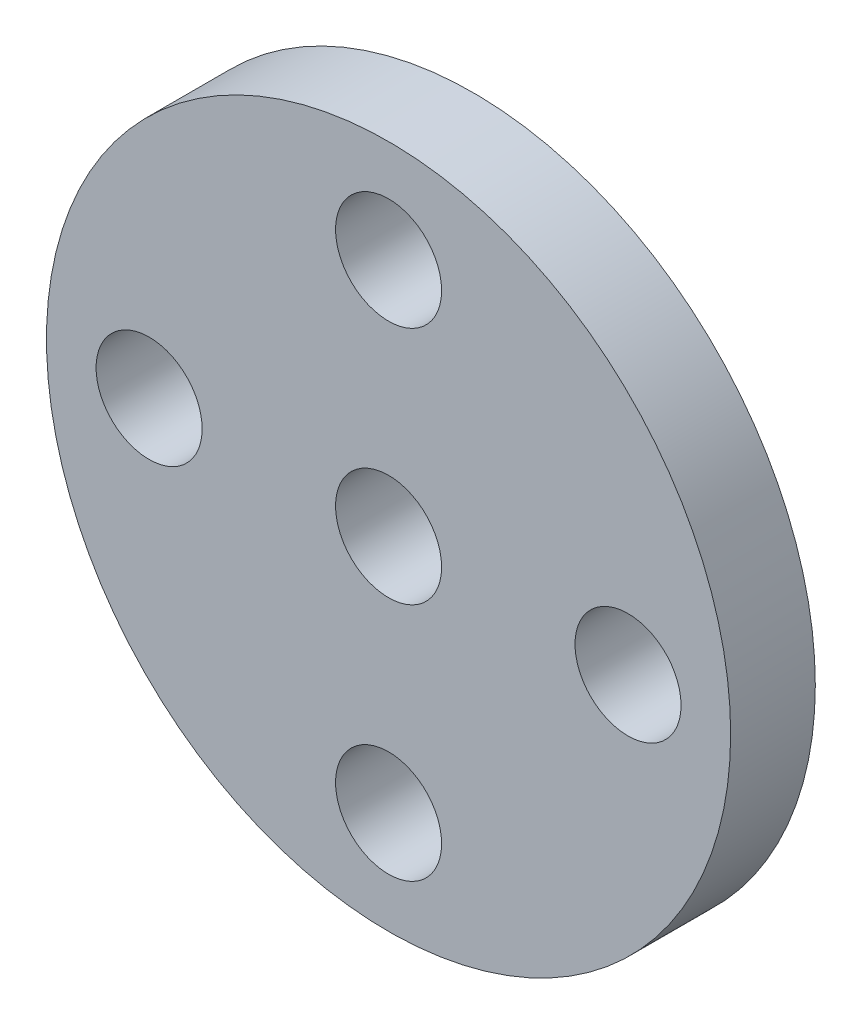
ISO-10303-21;
HEADER;
FILE_DESCRIPTION(('STEP AP214'),'2;1');
FILE_NAME('part.step','',(''),(''),'','','');
FILE_SCHEMA(('AUTOMOTIVE_DESIGN { 1 0 10303 214 1 1 1 1 }'));
ENDSEC;
DATA;
#1=APPLICATION_CONTEXT('core data for automotive mechanical design processes');
#2=APPLICATION_PROTOCOL_DEFINITION('international standard','automotive_design',2000,#1);
#3=PRODUCT_CONTEXT('',#1,'mechanical');
#4=PRODUCT('Part','Part','',(#3));
#5=PRODUCT_RELATED_PRODUCT_CATEGORY('part','',(#4));
#6=PRODUCT_DEFINITION_FORMATION('','',#4);
#7=PRODUCT_DEFINITION_CONTEXT('part definition',#1,'design');
#8=PRODUCT_DEFINITION('design','',#6,#7);
#9=PRODUCT_DEFINITION_SHAPE('','',#8);
#10=(LENGTH_UNIT() NAMED_UNIT(*) SI_UNIT(.MILLI.,.METRE.));
#11=(NAMED_UNIT(*) PLANE_ANGLE_UNIT() SI_UNIT($,.RADIAN.));
#12=(NAMED_UNIT(*) SI_UNIT($,.STERADIAN.) SOLID_ANGLE_UNIT());
#13=UNCERTAINTY_MEASURE_WITH_UNIT(LENGTH_MEASURE(1.E-05),#10,'distance_accuracy_value','');
#14=(GEOMETRIC_REPRESENTATION_CONTEXT(3) GLOBAL_UNCERTAINTY_ASSIGNED_CONTEXT((#13)) GLOBAL_UNIT_ASSIGNED_CONTEXT((#10,
#11,#12)) REPRESENTATION_CONTEXT('',''));
#15=CARTESIAN_POINT('',(0.,0.,0.));
#16=DIRECTION('',(0.,0.,1.));
#17=DIRECTION('',(1.,0.,0.));
#18=AXIS2_PLACEMENT_3D('',#15,#16,#17);
#19=CARTESIAN_POINT('',(0.,0.,0.));
#20=DIRECTION('',(0.,0.,1.));
#21=DIRECTION('',(1.,0.,0.));
#22=AXIS2_PLACEMENT_3D('',#19,#20,#21);
#23=PLANE('',#22);
#24=CARTESIAN_POINT('',(0.,0.,0.));
#25=DIRECTION('',(0.,0.,1.));
#26=DIRECTION('',(1.,0.,0.));
#27=AXIS2_PLACEMENT_3D('',#24,#25,#26);
#28=CIRCLE('',#27,1.56573644405593);
#29=CARTESIAN_POINT('',(1.56573644405593,0.,0.));
#30=VERTEX_POINT('',#29);
#31=EDGE_CURVE('E77',#30,#30,#28,.T.);
#32=ORIENTED_EDGE('',*,*,#31,.T.);
#33=EDGE_LOOP('',(#32));
#34=FACE_BOUND('',#33,.T.);
#35=CARTESIAN_POINT('',(0.,0.,0.));
#36=DIRECTION('',(0.,0.,-1.));
#37=DIRECTION('',(-1.,0.,0.));
#38=AXIS2_PLACEMENT_3D('',#35,#36,#37);
#39=CIRCLE('',#38,3.);
#40=CARTESIAN_POINT('',(-3.,0.,0.));
#41=VERTEX_POINT('',#40);
#42=EDGE_CURVE('E197',#41,#41,#39,.T.);
#43=ORIENTED_EDGE('',*,*,#42,.T.);
#44=EDGE_LOOP('',(#43));
#45=FACE_BOUND('',#44,.T.);
#46=ADVANCED_FACE('F40',(#34,#45),#23,.F.);
#47=CARTESIAN_POINT('',(0.,0.,2.5));
#48=DIRECTION('',(0.,0.,1.));
#49=DIRECTION('',(1.,0.,0.));
#50=AXIS2_PLACEMENT_3D('',#47,#48,#49);
#51=PLANE('',#50);
#52=CARTESIAN_POINT('',(0.,7.07106781186547,2.5));
#53=DIRECTION('',(0.,0.,1.));
#54=DIRECTION('',(1.,0.,0.));
#55=AXIS2_PLACEMENT_3D('',#52,#53,#54);
#56=CIRCLE('',#55,1.56573644405593);
#57=CARTESIAN_POINT('',(1.56573644405593,7.07106781186547,2.5));
#58=VERTEX_POINT('',#57);
#59=EDGE_CURVE('E62',#58,#58,#56,.T.);
#60=ORIENTED_EDGE('',*,*,#59,.F.);
#61=EDGE_LOOP('',(#60));
#62=FACE_BOUND('',#61,.T.);
#63=CARTESIAN_POINT('',(7.07106781186547,0.,2.5));
#64=DIRECTION('',(0.,0.,1.));
#65=DIRECTION('',(1.,0.,0.));
#66=AXIS2_PLACEMENT_3D('',#63,#64,#65);
#67=CIRCLE('',#66,1.56573644405593);
#68=CARTESIAN_POINT('',(8.6368042559214,0.,2.5));
#69=VERTEX_POINT('',#68);
#70=EDGE_CURVE('E72',#69,#69,#67,.T.);
#71=ORIENTED_EDGE('',*,*,#70,.F.);
#72=EDGE_LOOP('',(#71));
#73=FACE_BOUND('',#72,.T.);
#74=CARTESIAN_POINT('',(0.,0.,2.5));
#75=DIRECTION('',(0.,0.,1.));
#76=DIRECTION('',(1.,0.,0.));
#77=AXIS2_PLACEMENT_3D('',#74,#75,#76);
#78=CIRCLE('',#77,10.1015254455221);
#79=CARTESIAN_POINT('',(10.1015254455221,0.,2.5));
#80=VERTEX_POINT('',#79);
#81=EDGE_CURVE('E44',#80,#80,#78,.T.);
#82=ORIENTED_EDGE('',*,*,#81,.T.);
#83=EDGE_LOOP('',(#82));
#84=FACE_BOUND('',#83,.T.);
#85=CARTESIAN_POINT('',(0.,0.,2.5));
#86=DIRECTION('',(0.,0.,1.));
#87=DIRECTION('',(1.,0.,0.));
#88=AXIS2_PLACEMENT_3D('',#85,#86,#87);
#89=CIRCLE('',#88,1.56573644405593);
#90=CARTESIAN_POINT('',(1.56573644405593,0.,2.5));
#91=VERTEX_POINT('',#90);
#92=EDGE_CURVE('E79',#91,#91,#89,.T.);
#93=ORIENTED_EDGE('',*,*,#92,.F.);
#94=EDGE_LOOP('',(#93));
#95=FACE_BOUND('',#94,.T.);
#96=CARTESIAN_POINT('',(-7.07106781186547,0.,2.5));
#97=DIRECTION('',(0.,0.,1.));
#98=DIRECTION('',(1.,0.,0.));
#99=AXIS2_PLACEMENT_3D('',#96,#97,#98);
#100=CIRCLE('',#99,1.56573644405593);
#101=CARTESIAN_POINT('',(-5.50533136780955,0.,2.5));
#102=VERTEX_POINT('',#101);
#103=EDGE_CURVE('E70',#102,#102,#100,.T.);
#104=ORIENTED_EDGE('',*,*,#103,.F.);
#105=EDGE_LOOP('',(#104));
#106=FACE_BOUND('',#105,.T.);
#107=CARTESIAN_POINT('',(0.,-7.07106781186547,2.5));
#108=DIRECTION('',(0.,0.,1.));
#109=DIRECTION('',(1.,0.,0.));
#110=AXIS2_PLACEMENT_3D('',#107,#108,#109);
#111=CIRCLE('',#110,1.56573644405593);
#112=CARTESIAN_POINT('',(1.56573644405593,-7.07106781186547,2.5));
#113=VERTEX_POINT('',#112);
#114=EDGE_CURVE('E53',#113,#113,#111,.T.);
#115=ORIENTED_EDGE('',*,*,#114,.F.);
#116=EDGE_LOOP('',(#115));
#117=FACE_BOUND('',#116,.T.);
#118=ADVANCED_FACE('F101',(#62,#73,#84,#95,#106,#117),#51,.T.);
#119=CARTESIAN_POINT('',(0.,0.,0.));
#120=DIRECTION('',(0.,0.,-1.));
#121=DIRECTION('',(-1.,0.,0.));
#122=AXIS2_PLACEMENT_3D('',#119,#120,#121);
#123=CIRCLE('',#122,4.5);
#124=CARTESIAN_POINT('',(-4.5,0.,0.));
#125=VERTEX_POINT('',#124);
#126=EDGE_CURVE('E10',#125,#125,#123,.T.);
#127=ORIENTED_EDGE('',*,*,#126,.F.);
#128=EDGE_LOOP('',(#127));
#129=FACE_BOUND('',#128,.T.);
#130=CARTESIAN_POINT('',(0.,0.,0.));
#131=DIRECTION('',(0.,0.,1.));
#132=DIRECTION('',(1.,0.,0.));
#133=AXIS2_PLACEMENT_3D('',#130,#131,#132);
#134=CIRCLE('',#133,10.1015254455221);
#135=CARTESIAN_POINT('',(10.1015254455221,0.,0.));
#136=VERTEX_POINT('',#135);
#137=EDGE_CURVE('E41',#136,#136,#134,.T.);
#138=ORIENTED_EDGE('',*,*,#137,.F.);
#139=EDGE_LOOP('',(#138));
#140=FACE_BOUND('',#139,.T.);
#141=CARTESIAN_POINT('',(7.07106781186547,0.,0.));
#142=DIRECTION('',(0.,0.,1.));
#143=DIRECTION('',(1.,0.,0.));
#144=AXIS2_PLACEMENT_3D('',#141,#142,#143);
#145=CIRCLE('',#144,1.56573644405593);
#146=CARTESIAN_POINT('',(8.6368042559214,0.,0.));
#147=VERTEX_POINT('',#146);
#148=EDGE_CURVE('E69',#147,#147,#145,.T.);
#149=ORIENTED_EDGE('',*,*,#148,.T.);
#150=EDGE_LOOP('',(#149));
#151=FACE_BOUND('',#150,.T.);
#152=CARTESIAN_POINT('',(-7.07106781186547,0.,0.));
#153=DIRECTION('',(0.,0.,1.));
#154=DIRECTION('',(1.,0.,0.));
#155=AXIS2_PLACEMENT_3D('',#152,#153,#154);
#156=CIRCLE('',#155,1.56573644405593);
#157=CARTESIAN_POINT('',(-5.50533136780955,0.,0.));
#158=VERTEX_POINT('',#157);
#159=EDGE_CURVE('E61',#158,#158,#156,.T.);
#160=ORIENTED_EDGE('',*,*,#159,.T.);
#161=EDGE_LOOP('',(#160));
#162=FACE_BOUND('',#161,.T.);
#163=CARTESIAN_POINT('',(0.,7.07106781186547,0.));
#164=DIRECTION('',(0.,0.,1.));
#165=DIRECTION('',(1.,0.,0.));
#166=AXIS2_PLACEMENT_3D('',#163,#164,#165);
#167=CIRCLE('',#166,1.56573644405593);
#168=CARTESIAN_POINT('',(1.56573644405593,7.07106781186547,0.));
#169=VERTEX_POINT('',#168);
#170=EDGE_CURVE('E60',#169,#169,#167,.T.);
#171=ORIENTED_EDGE('',*,*,#170,.T.);
#172=EDGE_LOOP('',(#171));
#173=FACE_BOUND('',#172,.T.);
#174=CARTESIAN_POINT('',(0.,-7.07106781186547,0.));
#175=DIRECTION('',(0.,0.,1.));
#176=DIRECTION('',(1.,0.,0.));
#177=AXIS2_PLACEMENT_3D('',#174,#175,#176);
#178=CIRCLE('',#177,1.56573644405593);
#179=CARTESIAN_POINT('',(1.56573644405593,-7.07106781186547,0.));
#180=VERTEX_POINT('',#179);
#181=EDGE_CURVE('E59',#180,#180,#178,.T.);
#182=ORIENTED_EDGE('',*,*,#181,.T.);
#183=EDGE_LOOP('',(#182));
#184=FACE_BOUND('',#183,.T.);
#185=ADVANCED_FACE('F100',(#129,#140,#151,#162,#173,#184),#23,.F.);
#186=CARTESIAN_POINT('',(0.,0.,2.5));
#187=DIRECTION('',(0.,0.,-1.));
#188=DIRECTION('',(-1.,0.,0.));
#189=AXIS2_PLACEMENT_3D('',#186,#187,#188);
#190=CYLINDRICAL_SURFACE('',#189,10.1015254455221);
#191=ORIENTED_EDGE('',*,*,#81,.F.);
#192=EDGE_LOOP('',(#191));
#193=FACE_BOUND('',#192,.T.);
#194=ORIENTED_EDGE('',*,*,#137,.T.);
#195=EDGE_LOOP('',(#194));
#196=FACE_BOUND('',#195,.T.);
#197=ADVANCED_FACE('F39',(#193,#196),#190,.T.);
#198=CARTESIAN_POINT('',(0.,0.,2.5));
#199=DIRECTION('',(0.,0.,-1.));
#200=DIRECTION('',(-1.,0.,0.));
#201=AXIS2_PLACEMENT_3D('',#198,#199,#200);
#202=CYLINDRICAL_SURFACE('',#201,1.56573644405593);
#203=ORIENTED_EDGE('',*,*,#92,.T.);
#204=EDGE_LOOP('',(#203));
#205=FACE_BOUND('',#204,.T.);
#206=ORIENTED_EDGE('',*,*,#31,.F.);
#207=EDGE_LOOP('',(#206));
#208=FACE_BOUND('',#207,.T.);
#209=ADVANCED_FACE('F90',(#205,#208),#202,.F.);
#210=CARTESIAN_POINT('',(7.07106781186547,0.,2.5));
#211=DIRECTION('',(0.,0.,-1.));
#212=DIRECTION('',(-1.,0.,0.));
#213=AXIS2_PLACEMENT_3D('',#210,#211,#212);
#214=CYLINDRICAL_SURFACE('',#213,1.56573644405593);
#215=ORIENTED_EDGE('',*,*,#70,.T.);
#216=EDGE_LOOP('',(#215));
#217=FACE_BOUND('',#216,.T.);
#218=ORIENTED_EDGE('',*,*,#148,.F.);
#219=EDGE_LOOP('',(#218));
#220=FACE_BOUND('',#219,.T.);
#221=ADVANCED_FACE('F87',(#217,#220),#214,.F.);
#222=CARTESIAN_POINT('',(-7.07106781186547,0.,2.5));
#223=DIRECTION('',(0.,0.,-1.));
#224=DIRECTION('',(-1.,0.,0.));
#225=AXIS2_PLACEMENT_3D('',#222,#223,#224);
#226=CYLINDRICAL_SURFACE('',#225,1.56573644405593);
#227=ORIENTED_EDGE('',*,*,#103,.T.);
#228=EDGE_LOOP('',(#227));
#229=FACE_BOUND('',#228,.T.);
#230=ORIENTED_EDGE('',*,*,#159,.F.);
#231=EDGE_LOOP('',(#230));
#232=FACE_BOUND('',#231,.T.);
#233=ADVANCED_FACE('F98',(#229,#232),#226,.F.);
#234=CARTESIAN_POINT('',(0.,7.07106781186547,2.5));
#235=DIRECTION('',(0.,0.,-1.));
#236=DIRECTION('',(-1.,0.,0.));
#237=AXIS2_PLACEMENT_3D('',#234,#235,#236);
#238=CYLINDRICAL_SURFACE('',#237,1.56573644405593);
#239=ORIENTED_EDGE('',*,*,#59,.T.);
#240=EDGE_LOOP('',(#239));
#241=FACE_BOUND('',#240,.T.);
#242=ORIENTED_EDGE('',*,*,#170,.F.);
#243=EDGE_LOOP('',(#242));
#244=FACE_BOUND('',#243,.T.);
#245=ADVANCED_FACE('F130',(#241,#244),#238,.F.);
#246=CARTESIAN_POINT('',(0.,-7.07106781186547,2.5));
#247=DIRECTION('',(0.,0.,-1.));
#248=DIRECTION('',(-1.,0.,0.));
#249=AXIS2_PLACEMENT_3D('',#246,#247,#248);
#250=CYLINDRICAL_SURFACE('',#249,1.56573644405593);
#251=ORIENTED_EDGE('',*,*,#114,.T.);
#252=EDGE_LOOP('',(#251));
#253=FACE_BOUND('',#252,.T.);
#254=ORIENTED_EDGE('',*,*,#181,.F.);
#255=EDGE_LOOP('',(#254));
#256=FACE_BOUND('',#255,.T.);
#257=ADVANCED_FACE('F127',(#253,#256),#250,.F.);
#258=CARTESIAN_POINT('',(0.,0.,-2.));
#259=DIRECTION('',(0.,0.,-1.));
#260=DIRECTION('',(-1.,0.,0.));
#261=AXIS2_PLACEMENT_3D('',#258,#259,#260);
#262=PLANE('',#261);
#263=CARTESIAN_POINT('',(0.,0.,-2.));
#264=DIRECTION('',(0.,0.,-1.));
#265=DIRECTION('',(-1.,0.,0.));
#266=AXIS2_PLACEMENT_3D('',#263,#264,#265);
#267=CIRCLE('',#266,4.5);
#268=CARTESIAN_POINT('',(-4.5,0.,-2.));
#269=VERTEX_POINT('',#268);
#270=EDGE_CURVE('E55',#269,#269,#267,.T.);
#271=ORIENTED_EDGE('',*,*,#270,.T.);
#272=EDGE_LOOP('',(#271));
#273=FACE_BOUND('',#272,.T.);
#274=CARTESIAN_POINT('',(0.,0.,-2.));
#275=DIRECTION('',(0.,0.,-1.));
#276=DIRECTION('',(-1.,0.,0.));
#277=AXIS2_PLACEMENT_3D('',#274,#275,#276);
#278=CIRCLE('',#277,3.);
#279=CARTESIAN_POINT('',(-3.,0.,-2.));
#280=VERTEX_POINT('',#279);
#281=EDGE_CURVE('E198',#280,#280,#278,.T.);
#282=ORIENTED_EDGE('',*,*,#281,.F.);
#283=EDGE_LOOP('',(#282));
#284=FACE_BOUND('',#283,.T.);
#285=ADVANCED_FACE('F129',(#273,#284),#262,.T.);
#286=CARTESIAN_POINT('',(0.,0.,-2.));
#287=DIRECTION('',(0.,0.,1.));
#288=DIRECTION('',(1.,0.,0.));
#289=AXIS2_PLACEMENT_3D('',#286,#287,#288);
#290=CYLINDRICAL_SURFACE('',#289,4.5);
#291=ORIENTED_EDGE('',*,*,#270,.F.);
#292=EDGE_LOOP('',(#291));
#293=FACE_BOUND('',#292,.T.);
#294=ORIENTED_EDGE('',*,*,#126,.T.);
#295=EDGE_LOOP('',(#294));
#296=FACE_BOUND('',#295,.T.);
#297=ADVANCED_FACE('F132',(#293,#296),#290,.T.);
#298=CARTESIAN_POINT('',(0.,0.,-2.));
#299=DIRECTION('',(0.,0.,1.));
#300=DIRECTION('',(1.,0.,0.));
#301=AXIS2_PLACEMENT_3D('',#298,#299,#300);
#302=CYLINDRICAL_SURFACE('',#301,3.);
#303=ORIENTED_EDGE('',*,*,#281,.T.);
#304=EDGE_LOOP('',(#303));
#305=FACE_BOUND('',#304,.T.);
#306=ORIENTED_EDGE('',*,*,#42,.F.);
#307=EDGE_LOOP('',(#306));
#308=FACE_BOUND('',#307,.T.);
#309=ADVANCED_FACE('F181',(#305,#308),#302,.F.);
#310=CLOSED_SHELL('',(#46,#118,#185,#197,#209,#221,#233,#245,#257,#285,#297,#309));
#311=MANIFOLD_SOLID_BREP('B2',#310);
#312=ADVANCED_BREP_SHAPE_REPRESENTATION('',(#18,#311),#14);
#313=SHAPE_DEFINITION_REPRESENTATION(#9,#312);
ENDSEC;
END-ISO-10303-21;
